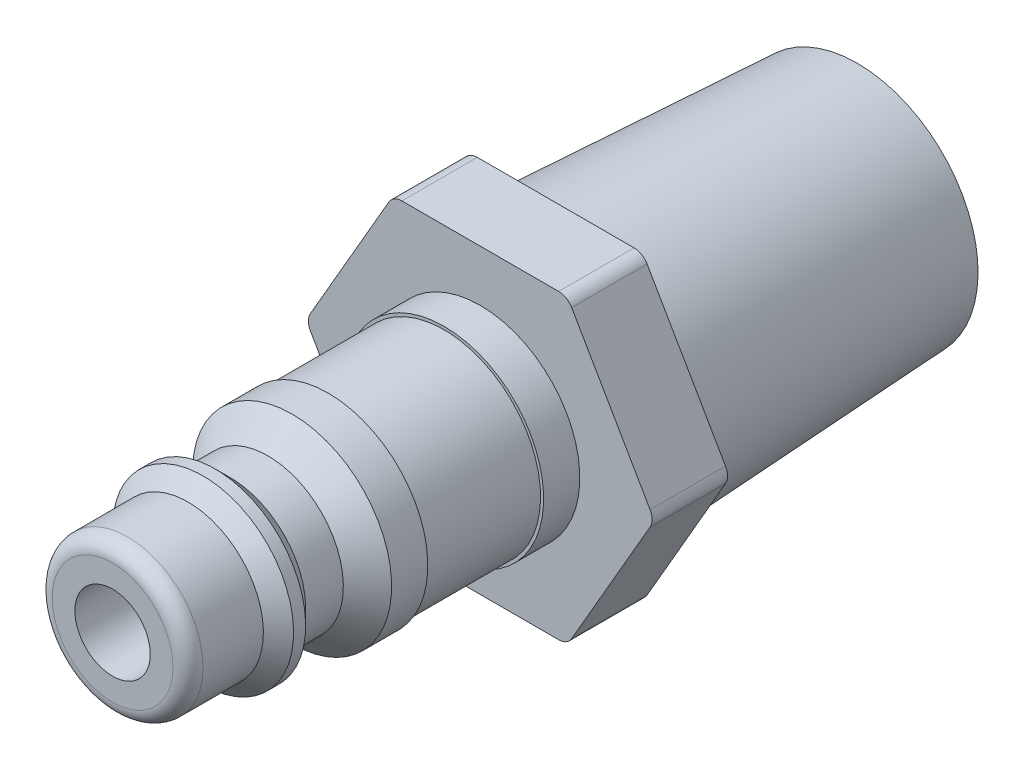
ISO-10303-21;
HEADER;
FILE_DESCRIPTION(('STEP AP214'),'2;1');
FILE_NAME('part.step','',(''),(''),'','','');
FILE_SCHEMA(('AUTOMOTIVE_DESIGN { 1 0 10303 214 1 1 1 1 }'));
ENDSEC;
DATA;
#1=APPLICATION_CONTEXT('core data for automotive mechanical design processes');
#2=APPLICATION_PROTOCOL_DEFINITION('international standard','automotive_design',2000,#1);
#3=PRODUCT_CONTEXT('',#1,'mechanical');
#4=PRODUCT('Part','Part','',(#3));
#5=PRODUCT_RELATED_PRODUCT_CATEGORY('part','',(#4));
#6=PRODUCT_DEFINITION_FORMATION('','',#4);
#7=PRODUCT_DEFINITION_CONTEXT('part definition',#1,'design');
#8=PRODUCT_DEFINITION('design','',#6,#7);
#9=PRODUCT_DEFINITION_SHAPE('','',#8);
#10=(LENGTH_UNIT() NAMED_UNIT(*) SI_UNIT(.MILLI.,.METRE.));
#11=(NAMED_UNIT(*) PLANE_ANGLE_UNIT() SI_UNIT($,.RADIAN.));
#12=(NAMED_UNIT(*) SI_UNIT($,.STERADIAN.) SOLID_ANGLE_UNIT());
#13=UNCERTAINTY_MEASURE_WITH_UNIT(LENGTH_MEASURE(1.E-05),#10,'distance_accuracy_value','');
#14=(GEOMETRIC_REPRESENTATION_CONTEXT(3) GLOBAL_UNCERTAINTY_ASSIGNED_CONTEXT((#13)) GLOBAL_UNIT_ASSIGNED_CONTEXT((#10,
#11,#12)) REPRESENTATION_CONTEXT('',''));
#15=CARTESIAN_POINT('',(0.,0.,0.));
#16=DIRECTION('',(0.,0.,1.));
#17=DIRECTION('',(1.,0.,0.));
#18=AXIS2_PLACEMENT_3D('',#15,#16,#17);
#19=CARTESIAN_POINT('',(-3.66617420935412,-6.35,-31.353125));
#20=DIRECTION('',(0.866025403784439,0.499999999999999,0.));
#21=DIRECTION('',(-0.5,0.866025403784439,0.));
#22=AXIS2_PLACEMENT_3D('',#19,#20,#21);
#23=PLANE('',#22);
#24=DIRECTION('',(-0.5,0.866025403784439,0.));
#25=VECTOR('',#24,1.);
#26=CARTESIAN_POINT('',(-3.66617420935412,-6.35,-15.478125));
#27=LINE('',#26,#25);
#28=CARTESIAN_POINT('',(-3.84948291982183,-6.0325,-15.478125));
#29=VERTEX_POINT('',#28);
#30=CARTESIAN_POINT('',(-7.14903970824054,-0.317499999999997,-15.478125));
#31=VERTEX_POINT('',#30);
#32=EDGE_CURVE('E327',#29,#31,#27,.T.);
#33=ORIENTED_EDGE('',*,*,#32,.T.);
#34=DIRECTION('',(0.,0.,1.));
#35=VECTOR('',#34,1.);
#36=CARTESIAN_POINT('',(-7.14903970824054,-0.317499999999998,-31.353125));
#37=LINE('',#36,#35);
#38=CARTESIAN_POINT('',(-7.14903970824054,-0.317499999999996,-18.653125));
#39=VERTEX_POINT('',#38);
#40=EDGE_CURVE('E179',#31,#39,#37,.F.);
#41=ORIENTED_EDGE('',*,*,#40,.T.);
#42=DIRECTION('',(-0.5,0.866025403784439,0.));
#43=VECTOR('',#42,1.);
#44=CARTESIAN_POINT('',(-3.66617420935412,-6.35,-18.653125));
#45=LINE('',#44,#43);
#46=CARTESIAN_POINT('',(-3.84948291982183,-6.0325,-18.653125));
#47=VERTEX_POINT('',#46);
#48=EDGE_CURVE('E324',#47,#39,#45,.T.);
#49=ORIENTED_EDGE('',*,*,#48,.F.);
#50=DIRECTION('',(0.,0.,1.));
#51=VECTOR('',#50,1.);
#52=CARTESIAN_POINT('',(-3.84948291982183,-6.0325,-31.353125));
#53=LINE('',#52,#51);
#54=EDGE_CURVE('E133',#47,#29,#53,.T.);
#55=ORIENTED_EDGE('',*,*,#54,.T.);
#56=EDGE_LOOP('',(#33,#41,#49,#55));
#57=FACE_BOUND('',#56,.T.);
#58=ADVANCED_FACE('F32',(#57),#23,.F.);
#59=CARTESIAN_POINT('',(-7.33234841870824,0.,-31.353125));
#60=DIRECTION('',(0.866025403784439,-0.5,0.));
#61=DIRECTION('',(0.5,0.866025403784439,0.));
#62=AXIS2_PLACEMENT_3D('',#59,#60,#61);
#63=PLANE('',#62);
#64=DIRECTION('',(0.5,0.866025403784439,0.));
#65=VECTOR('',#64,1.);
#66=CARTESIAN_POINT('',(-7.33234841870824,0.,-15.478125));
#67=LINE('',#66,#65);
#68=CARTESIAN_POINT('',(-7.14903970824054,0.317500000000002,-15.478125));
#69=VERTEX_POINT('',#68);
#70=CARTESIAN_POINT('',(-3.84948291982183,6.03250000000001,-15.478125));
#71=VERTEX_POINT('',#70);
#72=EDGE_CURVE('E329',#69,#71,#67,.T.);
#73=ORIENTED_EDGE('',*,*,#72,.T.);
#74=DIRECTION('',(0.,0.,1.));
#75=VECTOR('',#74,1.);
#76=CARTESIAN_POINT('',(-3.84948291982183,6.03250000000001,-31.353125));
#77=LINE('',#76,#75);
#78=CARTESIAN_POINT('',(-3.84948291982183,6.03250000000001,-18.653125));
#79=VERTEX_POINT('',#78);
#80=EDGE_CURVE('E167',#71,#79,#77,.F.);
#81=ORIENTED_EDGE('',*,*,#80,.T.);
#82=DIRECTION('',(0.5,0.866025403784439,0.));
#83=VECTOR('',#82,1.);
#84=CARTESIAN_POINT('',(-7.33234841870824,0.,-18.653125));
#85=LINE('',#84,#83);
#86=CARTESIAN_POINT('',(-7.14903970824054,0.317500000000002,-18.653125));
#87=VERTEX_POINT('',#86);
#88=EDGE_CURVE('E129',#87,#79,#85,.T.);
#89=ORIENTED_EDGE('',*,*,#88,.F.);
#90=DIRECTION('',(0.,0.,1.));
#91=VECTOR('',#90,1.);
#92=CARTESIAN_POINT('',(-7.14903970824054,0.317500000000002,-31.353125));
#93=LINE('',#92,#91);
#94=EDGE_CURVE('E164',#87,#69,#93,.T.);
#95=ORIENTED_EDGE('',*,*,#94,.T.);
#96=EDGE_LOOP('',(#73,#81,#89,#95));
#97=FACE_BOUND('',#96,.T.);
#98=ADVANCED_FACE('F210',(#97),#63,.F.);
#99=CARTESIAN_POINT('',(-3.66617420935412,6.35000000000001,-31.353125));
#100=DIRECTION('',(0.,-1.,0.));
#101=DIRECTION('',(0.,0.,-1.));
#102=AXIS2_PLACEMENT_3D('',#99,#100,#101);
#103=PLANE('',#102);
#104=DIRECTION('',(1.,0.,0.));
#105=VECTOR('',#104,1.);
#106=CARTESIAN_POINT('',(-3.66617420935412,6.35000000000001,-18.653125));
#107=LINE('',#106,#105);
#108=CARTESIAN_POINT('',(-3.29955678841871,6.35000000000001,-18.653125));
#109=VERTEX_POINT('',#108);
#110=CARTESIAN_POINT('',(3.29955678841871,6.35000000000001,-18.653125));
#111=VERTEX_POINT('',#110);
#112=EDGE_CURVE('E126',#109,#111,#107,.T.);
#113=ORIENTED_EDGE('',*,*,#112,.F.);
#114=DIRECTION('',(0.,0.,1.));
#115=VECTOR('',#114,1.);
#116=CARTESIAN_POINT('',(-3.29955678841871,6.35000000000001,-31.353125));
#117=LINE('',#116,#115);
#118=CARTESIAN_POINT('',(-3.29955678841871,6.35000000000001,-15.478125));
#119=VERTEX_POINT('',#118);
#120=EDGE_CURVE('E140',#109,#119,#117,.T.);
#121=ORIENTED_EDGE('',*,*,#120,.T.);
#122=DIRECTION('',(1.,0.,0.));
#123=VECTOR('',#122,1.);
#124=CARTESIAN_POINT('',(-3.66617420935412,6.35000000000001,-15.478125));
#125=LINE('',#124,#123);
#126=CARTESIAN_POINT('',(3.29955678841871,6.35000000000001,-15.478125));
#127=VERTEX_POINT('',#126);
#128=EDGE_CURVE('E332',#119,#127,#125,.T.);
#129=ORIENTED_EDGE('',*,*,#128,.T.);
#130=DIRECTION('',(0.,0.,1.));
#131=VECTOR('',#130,1.);
#132=CARTESIAN_POINT('',(3.29955678841871,6.35000000000001,-31.353125));
#133=LINE('',#132,#131);
#134=EDGE_CURVE('E143',#127,#111,#133,.F.);
#135=ORIENTED_EDGE('',*,*,#134,.T.);
#136=EDGE_LOOP('',(#113,#121,#129,#135));
#137=FACE_BOUND('',#136,.T.);
#138=ADVANCED_FACE('F138',(#137),#103,.F.);
#139=CARTESIAN_POINT('',(3.66617420935412,6.35000000000001,-31.353125));
#140=DIRECTION('',(-0.866025403784439,-0.5,0.));
#141=DIRECTION('',(0.5,-0.866025403784439,0.));
#142=AXIS2_PLACEMENT_3D('',#139,#140,#141);
#143=PLANE('',#142);
#144=DIRECTION('',(0.5,-0.866025403784439,0.));
#145=VECTOR('',#144,1.);
#146=CARTESIAN_POINT('',(3.66617420935412,6.35000000000001,-15.478125));
#147=LINE('',#146,#145);
#148=CARTESIAN_POINT('',(3.84948291982183,6.03250000000001,-15.478125));
#149=VERTEX_POINT('',#148);
#150=CARTESIAN_POINT('',(7.14903970824054,0.317499999999998,-15.478125));
#151=VERTEX_POINT('',#150);
#152=EDGE_CURVE('E334',#149,#151,#147,.T.);
#153=ORIENTED_EDGE('',*,*,#152,.T.);
#154=DIRECTION('',(0.,0.,1.));
#155=VECTOR('',#154,1.);
#156=CARTESIAN_POINT('',(7.14903970824054,0.317499999999997,-31.353125));
#157=LINE('',#156,#155);
#158=CARTESIAN_POINT('',(7.14903970824054,0.317499999999997,-18.653125));
#159=VERTEX_POINT('',#158);
#160=EDGE_CURVE('E193',#151,#159,#157,.F.);
#161=ORIENTED_EDGE('',*,*,#160,.T.);
#162=DIRECTION('',(0.5,-0.866025403784439,0.));
#163=VECTOR('',#162,1.);
#164=CARTESIAN_POINT('',(3.66617420935412,6.35000000000001,-18.653125));
#165=LINE('',#164,#163);
#166=CARTESIAN_POINT('',(3.84948291982183,6.03250000000001,-18.653125));
#167=VERTEX_POINT('',#166);
#168=EDGE_CURVE('E144',#167,#159,#165,.T.);
#169=ORIENTED_EDGE('',*,*,#168,.F.);
#170=DIRECTION('',(0.,0.,1.));
#171=VECTOR('',#170,1.);
#172=CARTESIAN_POINT('',(3.84948291982183,6.03250000000001,-31.353125));
#173=LINE('',#172,#171);
#174=EDGE_CURVE('E190',#167,#149,#173,.T.);
#175=ORIENTED_EDGE('',*,*,#174,.T.);
#176=EDGE_LOOP('',(#153,#161,#169,#175));
#177=FACE_BOUND('',#176,.T.);
#178=ADVANCED_FACE('F393',(#177),#143,.F.);
#179=CARTESIAN_POINT('',(7.33234841870825,0.,-31.353125));
#180=DIRECTION('',(-0.866025403784439,0.5,0.));
#181=DIRECTION('',(-0.5,-0.866025403784439,0.));
#182=AXIS2_PLACEMENT_3D('',#179,#180,#181);
#183=PLANE('',#182);
#184=DIRECTION('',(-0.5,-0.866025403784439,0.));
#185=VECTOR('',#184,1.);
#186=CARTESIAN_POINT('',(7.33234841870825,0.,-15.478125));
#187=LINE('',#186,#185);
#188=CARTESIAN_POINT('',(7.14903970824054,-0.317500000000002,-15.478125));
#189=VERTEX_POINT('',#188);
#190=CARTESIAN_POINT('',(3.84948291982183,-6.0325,-15.478125));
#191=VERTEX_POINT('',#190);
#192=EDGE_CURVE('E337',#189,#191,#187,.T.);
#193=ORIENTED_EDGE('',*,*,#192,.T.);
#194=DIRECTION('',(0.,0.,1.));
#195=VECTOR('',#194,1.);
#196=CARTESIAN_POINT('',(3.84948291982183,-6.0325,-31.353125));
#197=LINE('',#196,#195);
#198=CARTESIAN_POINT('',(3.84948291982183,-6.0325,-18.653125));
#199=VERTEX_POINT('',#198);
#200=EDGE_CURVE('E188',#191,#199,#197,.F.);
#201=ORIENTED_EDGE('',*,*,#200,.T.);
#202=DIRECTION('',(-0.5,-0.866025403784439,0.));
#203=VECTOR('',#202,1.);
#204=CARTESIAN_POINT('',(7.33234841870825,0.,-18.653125));
#205=LINE('',#204,#203);
#206=CARTESIAN_POINT('',(7.14903970824054,-0.317500000000002,-18.653125));
#207=VERTEX_POINT('',#206);
#208=EDGE_CURVE('E308',#207,#199,#205,.T.);
#209=ORIENTED_EDGE('',*,*,#208,.F.);
#210=DIRECTION('',(0.,0.,1.));
#211=VECTOR('',#210,1.);
#212=CARTESIAN_POINT('',(7.14903970824054,-0.317500000000002,-31.353125));
#213=LINE('',#212,#211);
#214=EDGE_CURVE('E185',#207,#189,#213,.T.);
#215=ORIENTED_EDGE('',*,*,#214,.T.);
#216=EDGE_LOOP('',(#193,#201,#209,#215));
#217=FACE_BOUND('',#216,.T.);
#218=ADVANCED_FACE('F312',(#217),#183,.F.);
#219=CARTESIAN_POINT('',(3.66617420935413,-6.35,-31.353125));
#220=DIRECTION('',(0.,1.,0.));
#221=DIRECTION('',(-1.,0.,0.));
#222=AXIS2_PLACEMENT_3D('',#219,#220,#221);
#223=PLANE('',#222);
#224=DIRECTION('',(-1.,0.,0.));
#225=VECTOR('',#224,1.);
#226=CARTESIAN_POINT('',(3.66617420935413,-6.35,-15.478125));
#227=LINE('',#226,#225);
#228=CARTESIAN_POINT('',(3.29955678841872,-6.35,-15.478125));
#229=VERTEX_POINT('',#228);
#230=CARTESIAN_POINT('',(-3.29955678841871,-6.35,-15.478125));
#231=VERTEX_POINT('',#230);
#232=EDGE_CURVE('E339',#229,#231,#227,.T.);
#233=ORIENTED_EDGE('',*,*,#232,.T.);
#234=DIRECTION('',(0.,0.,1.));
#235=VECTOR('',#234,1.);
#236=CARTESIAN_POINT('',(-3.29955678841871,-6.35,-31.353125));
#237=LINE('',#236,#235);
#238=CARTESIAN_POINT('',(-3.29955678841871,-6.35,-18.653125));
#239=VERTEX_POINT('',#238);
#240=EDGE_CURVE('E47',#231,#239,#237,.F.);
#241=ORIENTED_EDGE('',*,*,#240,.T.);
#242=DIRECTION('',(-1.,0.,0.));
#243=VECTOR('',#242,1.);
#244=CARTESIAN_POINT('',(3.66617420935413,-6.35,-18.653125));
#245=LINE('',#244,#243);
#246=CARTESIAN_POINT('',(3.29955678841872,-6.35,-18.653125));
#247=VERTEX_POINT('',#246);
#248=EDGE_CURVE('E152',#247,#239,#245,.T.);
#249=ORIENTED_EDGE('',*,*,#248,.F.);
#250=DIRECTION('',(0.,0.,1.));
#251=VECTOR('',#250,1.);
#252=CARTESIAN_POINT('',(3.29955678841872,-6.35,-31.353125));
#253=LINE('',#252,#251);
#254=EDGE_CURVE('E181',#247,#229,#253,.T.);
#255=ORIENTED_EDGE('',*,*,#254,.T.);
#256=EDGE_LOOP('',(#233,#241,#249,#255));
#257=FACE_BOUND('',#256,.T.);
#258=ADVANCED_FACE('F283',(#257),#223,.F.);
#259=CARTESIAN_POINT('',(0.,4.191,-9.08049999999999));
#260=DIRECTION('',(0.,0.,1.));
#261=DIRECTION('',(0.,-1.,0.));
#262=AXIS2_PLACEMENT_3D('',#259,#260,#261);
#263=PLANE('',#262);
#264=CARTESIAN_POINT('',(0.,0.,-9.08049999999999));
#265=DIRECTION('',(0.,0.,1.));
#266=DIRECTION('',(0.,-1.,0.));
#267=AXIS2_PLACEMENT_3D('',#264,#265,#266);
#268=CIRCLE('',#267,4.191);
#269=CARTESIAN_POINT('',(0.,-4.191,-9.08049999999999));
#270=VERTEX_POINT('',#269);
#271=EDGE_CURVE('E377',#270,#270,#268,.T.);
#272=ORIENTED_EDGE('',*,*,#271,.F.);
#273=EDGE_LOOP('',(#272));
#274=FACE_BOUND('',#273,.T.);
#275=CARTESIAN_POINT('',(0.,0.,-9.08049999999999));
#276=DIRECTION('',(0.,0.,1.));
#277=DIRECTION('',(0.,-1.,0.));
#278=AXIS2_PLACEMENT_3D('',#275,#276,#277);
#279=CIRCLE('',#278,4.064);
#280=CARTESIAN_POINT('',(0.,-4.064,-9.08049999999999));
#281=VERTEX_POINT('',#280);
#282=EDGE_CURVE('E341',#281,#281,#279,.T.);
#283=ORIENTED_EDGE('',*,*,#282,.T.);
#284=EDGE_LOOP('',(#283));
#285=FACE_BOUND('',#284,.T.);
#286=ADVANCED_FACE('F279',(#274,#285),#263,.F.);
#287=CARTESIAN_POINT('',(0.,0.,-12.7));
#288=DIRECTION('',(0.,0.,1.));
#289=DIRECTION('',(0.,-1.,0.));
#290=AXIS2_PLACEMENT_3D('',#287,#288,#289);
#291=CYLINDRICAL_SURFACE('',#290,4.191);
#292=CARTESIAN_POINT('',(0.,0.,-7.55649999999999));
#293=DIRECTION('',(0.,0.,1.));
#294=DIRECTION('',(0.,-1.,0.));
#295=AXIS2_PLACEMENT_3D('',#292,#293,#294);
#296=CIRCLE('',#295,4.191);
#297=CARTESIAN_POINT('',(0.,-4.191,-7.55649999999999));
#298=VERTEX_POINT('',#297);
#299=EDGE_CURVE('E374',#298,#298,#296,.T.);
#300=ORIENTED_EDGE('',*,*,#299,.F.);
#301=EDGE_LOOP('',(#300));
#302=FACE_BOUND('',#301,.T.);
#303=ORIENTED_EDGE('',*,*,#271,.T.);
#304=EDGE_LOOP('',(#303));
#305=FACE_BOUND('',#304,.T.);
#306=ADVANCED_FACE('F275',(#302,#305),#291,.T.);
#307=CARTESIAN_POINT('',(0.,0.,-7.55649999999999));
#308=DIRECTION('',(0.,0.,-1.));
#309=DIRECTION('',(0.,1.,0.));
#310=AXIS2_PLACEMENT_3D('',#307,#308,#309);
#311=CONICAL_SURFACE('',#310,4.191,0.78539816339745);
#312=CARTESIAN_POINT('',(0.,0.,-6.54049999999999));
#313=DIRECTION('',(0.,0.,1.));
#314=DIRECTION('',(0.,-1.,0.));
#315=AXIS2_PLACEMENT_3D('',#312,#313,#314);
#316=CIRCLE('',#315,3.175);
#317=CARTESIAN_POINT('',(0.,-3.175,-6.54049999999999));
#318=VERTEX_POINT('',#317);
#319=EDGE_CURVE('E371',#318,#318,#316,.T.);
#320=ORIENTED_EDGE('',*,*,#319,.F.);
#321=EDGE_LOOP('',(#320));
#322=FACE_BOUND('',#321,.T.);
#323=ORIENTED_EDGE('',*,*,#299,.T.);
#324=EDGE_LOOP('',(#323));
#325=FACE_BOUND('',#324,.T.);
#326=ADVANCED_FACE('F271',(#322,#325),#311,.T.);
#327=CARTESIAN_POINT('',(0.,0.,-12.7));
#328=DIRECTION('',(0.,0.,1.));
#329=DIRECTION('',(0.,-1.,0.));
#330=AXIS2_PLACEMENT_3D('',#327,#328,#329);
#331=CYLINDRICAL_SURFACE('',#330,3.175);
#332=CARTESIAN_POINT('',(0.,0.,-4.95299999999999));
#333=DIRECTION('',(0.,0.,1.));
#334=DIRECTION('',(0.,-1.,0.));
#335=AXIS2_PLACEMENT_3D('',#332,#333,#334);
#336=CIRCLE('',#335,3.175);
#337=CARTESIAN_POINT('',(0.,-3.175,-4.95299999999999));
#338=VERTEX_POINT('',#337);
#339=EDGE_CURVE('E368',#338,#338,#336,.T.);
#340=ORIENTED_EDGE('',*,*,#339,.F.);
#341=EDGE_LOOP('',(#340));
#342=FACE_BOUND('',#341,.T.);
#343=ORIENTED_EDGE('',*,*,#319,.T.);
#344=EDGE_LOOP('',(#343));
#345=FACE_BOUND('',#344,.T.);
#346=ADVANCED_FACE('F267',(#342,#345),#331,.T.);
#347=CARTESIAN_POINT('',(0.,0.,-4.95299999999999));
#348=DIRECTION('',(0.,0.,1.));
#349=DIRECTION('',(0.,-1.,0.));
#350=AXIS2_PLACEMENT_3D('',#347,#348,#349);
#351=CONICAL_SURFACE('',#350,3.175,0.78539816339745);
#352=CARTESIAN_POINT('',(0.,0.,-4.318));
#353=DIRECTION('',(0.,0.,1.));
#354=DIRECTION('',(0.,-1.,0.));
#355=AXIS2_PLACEMENT_3D('',#352,#353,#354);
#356=CIRCLE('',#355,3.81);
#357=CARTESIAN_POINT('',(0.,-3.81,-4.318));
#358=VERTEX_POINT('',#357);
#359=EDGE_CURVE('E365',#358,#358,#356,.T.);
#360=ORIENTED_EDGE('',*,*,#359,.F.);
#361=EDGE_LOOP('',(#360));
#362=FACE_BOUND('',#361,.T.);
#363=ORIENTED_EDGE('',*,*,#339,.T.);
#364=EDGE_LOOP('',(#363));
#365=FACE_BOUND('',#364,.T.);
#366=ADVANCED_FACE('F263',(#362,#365),#351,.T.);
#367=CARTESIAN_POINT('',(0.,0.,-12.7));
#368=DIRECTION('',(0.,0.,1.));
#369=DIRECTION('',(0.,-1.,0.));
#370=AXIS2_PLACEMENT_3D('',#367,#368,#369);
#371=CYLINDRICAL_SURFACE('',#370,3.81);
#372=CARTESIAN_POINT('',(0.,0.,-3.81));
#373=DIRECTION('',(0.,0.,1.));
#374=DIRECTION('',(0.,-1.,0.));
#375=AXIS2_PLACEMENT_3D('',#372,#373,#374);
#376=CIRCLE('',#375,3.81);
#377=CARTESIAN_POINT('',(0.,-3.81,-3.81));
#378=VERTEX_POINT('',#377);
#379=EDGE_CURVE('E362',#378,#378,#376,.T.);
#380=ORIENTED_EDGE('',*,*,#379,.F.);
#381=EDGE_LOOP('',(#380));
#382=FACE_BOUND('',#381,.T.);
#383=ORIENTED_EDGE('',*,*,#359,.T.);
#384=EDGE_LOOP('',(#383));
#385=FACE_BOUND('',#384,.T.);
#386=ADVANCED_FACE('F259',(#382,#385),#371,.T.);
#387=CARTESIAN_POINT('',(0.,0.,-3.81));
#388=DIRECTION('',(0.,0.,-1.));
#389=DIRECTION('',(0.,1.,0.));
#390=AXIS2_PLACEMENT_3D('',#387,#388,#389);
#391=CONICAL_SURFACE('',#390,3.81,0.785398163397451);
#392=CARTESIAN_POINT('',(0.,0.,-3.175));
#393=DIRECTION('',(0.,0.,1.));
#394=DIRECTION('',(0.,-1.,0.));
#395=AXIS2_PLACEMENT_3D('',#392,#393,#394);
#396=CIRCLE('',#395,3.175);
#397=CARTESIAN_POINT('',(0.,-3.175,-3.175));
#398=VERTEX_POINT('',#397);
#399=EDGE_CURVE('E359',#398,#398,#396,.T.);
#400=ORIENTED_EDGE('',*,*,#399,.F.);
#401=EDGE_LOOP('',(#400));
#402=FACE_BOUND('',#401,.T.);
#403=ORIENTED_EDGE('',*,*,#379,.T.);
#404=EDGE_LOOP('',(#403));
#405=FACE_BOUND('',#404,.T.);
#406=ADVANCED_FACE('F255',(#402,#405),#391,.T.);
#407=CARTESIAN_POINT('',(0.,0.,-12.7));
#408=DIRECTION('',(0.,0.,1.));
#409=DIRECTION('',(0.,-1.,0.));
#410=AXIS2_PLACEMENT_3D('',#407,#408,#409);
#411=CYLINDRICAL_SURFACE('',#410,3.175);
#412=CARTESIAN_POINT('',(0.,0.,-0.635));
#413=DIRECTION('',(0.,0.,-1.));
#414=DIRECTION('',(0.,1.,0.));
#415=AXIS2_PLACEMENT_3D('',#412,#413,#414);
#416=CIRCLE('',#415,3.175);
#417=CARTESIAN_POINT('',(0.,3.175,-0.635));
#418=VERTEX_POINT('',#417);
#419=EDGE_CURVE('E11',#418,#418,#416,.T.);
#420=ORIENTED_EDGE('',*,*,#419,.T.);
#421=EDGE_LOOP('',(#420));
#422=FACE_BOUND('',#421,.T.);
#423=ORIENTED_EDGE('',*,*,#399,.T.);
#424=EDGE_LOOP('',(#423));
#425=FACE_BOUND('',#424,.T.);
#426=ADVANCED_FACE('F252',(#422,#425),#411,.T.);
#427=CARTESIAN_POINT('',(0.,1.5875,0.));
#428=DIRECTION('',(0.,0.,-1.));
#429=DIRECTION('',(0.,1.,0.));
#430=AXIS2_PLACEMENT_3D('',#427,#428,#429);
#431=PLANE('',#430);
#432=CARTESIAN_POINT('',(0.,0.,0.));
#433=DIRECTION('',(0.,0.,-1.));
#434=DIRECTION('',(0.,1.,0.));
#435=AXIS2_PLACEMENT_3D('',#432,#433,#434);
#436=CIRCLE('',#435,2.54);
#437=CARTESIAN_POINT('',(0.,2.54,0.));
#438=VERTEX_POINT('',#437);
#439=EDGE_CURVE('E40',#438,#438,#436,.F.);
#440=ORIENTED_EDGE('',*,*,#439,.T.);
#441=EDGE_LOOP('',(#440));
#442=FACE_BOUND('',#441,.T.);
#443=CARTESIAN_POINT('',(0.,0.,0.));
#444=DIRECTION('',(0.,0.,1.));
#445=DIRECTION('',(0.,-1.,0.));
#446=AXIS2_PLACEMENT_3D('',#443,#444,#445);
#447=CIRCLE('',#446,1.5875);
#448=CARTESIAN_POINT('',(0.,-1.5875,0.));
#449=VERTEX_POINT('',#448);
#450=EDGE_CURVE('E356',#449,#449,#447,.T.);
#451=ORIENTED_EDGE('',*,*,#450,.F.);
#452=EDGE_LOOP('',(#451));
#453=FACE_BOUND('',#452,.T.);
#454=ADVANCED_FACE('F197',(#442,#453),#431,.F.);
#455=CARTESIAN_POINT('',(0.,0.,-12.7));
#456=DIRECTION('',(0.,0.,1.));
#457=DIRECTION('',(0.,-1.,0.));
#458=AXIS2_PLACEMENT_3D('',#455,#456,#457);
#459=CYLINDRICAL_SURFACE('',#458,1.5875);
#460=CARTESIAN_POINT('',(0.,0.,-12.7));
#461=DIRECTION('',(0.,0.,1.));
#462=DIRECTION('',(0.,-1.,0.));
#463=AXIS2_PLACEMENT_3D('',#460,#461,#462);
#464=CIRCLE('',#463,1.5875);
#465=CARTESIAN_POINT('',(0.,-1.5875,-12.7));
#466=VERTEX_POINT('',#465);
#467=EDGE_CURVE('E353',#466,#466,#464,.T.);
#468=ORIENTED_EDGE('',*,*,#467,.F.);
#469=EDGE_LOOP('',(#468));
#470=FACE_BOUND('',#469,.T.);
#471=ORIENTED_EDGE('',*,*,#450,.T.);
#472=EDGE_LOOP('',(#471));
#473=FACE_BOUND('',#472,.T.);
#474=ADVANCED_FACE('F245',(#470,#473),#459,.F.);
#475=CARTESIAN_POINT('',(0.,1.5875,-12.7));
#476=DIRECTION('',(0.,0.,-1.));
#477=DIRECTION('',(0.,1.,0.));
#478=AXIS2_PLACEMENT_3D('',#475,#476,#477);
#479=PLANE('',#478);
#480=ORIENTED_EDGE('',*,*,#467,.T.);
#481=EDGE_LOOP('',(#480));
#482=FACE_BOUND('',#481,.T.);
#483=ADVANCED_FACE('F236',(#482),#479,.F.);
#484=CARTESIAN_POINT('',(0.,4.191,-15.478125));
#485=DIRECTION('',(0.,0.,-1.));
#486=DIRECTION('',(0.,1.,0.));
#487=AXIS2_PLACEMENT_3D('',#484,#485,#486);
#488=PLANE('',#487);
#489=ORIENTED_EDGE('',*,*,#128,.F.);
#490=CARTESIAN_POINT('',(-3.29955678841871,5.71500000000001,-15.478125));
#491=DIRECTION('',(0.,0.,-1.));
#492=DIRECTION('',(0.,1.,0.));
#493=AXIS2_PLACEMENT_3D('',#490,#491,#492);
#494=CIRCLE('',#493,0.635);
#495=EDGE_CURVE('E147',#119,#71,#494,.F.);
#496=ORIENTED_EDGE('',*,*,#495,.T.);
#497=ORIENTED_EDGE('',*,*,#72,.F.);
#498=CARTESIAN_POINT('',(-6.59911357683742,0.,-15.478125));
#499=DIRECTION('',(0.,0.,-1.));
#500=DIRECTION('',(0.,1.,0.));
#501=AXIS2_PLACEMENT_3D('',#498,#499,#500);
#502=CIRCLE('',#501,0.635);
#503=EDGE_CURVE('E161',#69,#31,#502,.F.);
#504=ORIENTED_EDGE('',*,*,#503,.T.);
#505=ORIENTED_EDGE('',*,*,#32,.F.);
#506=CARTESIAN_POINT('',(-3.29955678841871,-5.715,-15.478125));
#507=DIRECTION('',(0.,0.,-1.));
#508=DIRECTION('',(0.,1.,0.));
#509=AXIS2_PLACEMENT_3D('',#506,#507,#508);
#510=CIRCLE('',#509,0.635);
#511=EDGE_CURVE('E159',#29,#231,#510,.F.);
#512=ORIENTED_EDGE('',*,*,#511,.T.);
#513=ORIENTED_EDGE('',*,*,#232,.F.);
#514=CARTESIAN_POINT('',(3.29955678841872,-5.715,-15.478125));
#515=DIRECTION('',(0.,0.,-1.));
#516=DIRECTION('',(0.,1.,0.));
#517=AXIS2_PLACEMENT_3D('',#514,#515,#516);
#518=CIRCLE('',#517,0.635);
#519=EDGE_CURVE('E157',#229,#191,#518,.F.);
#520=ORIENTED_EDGE('',*,*,#519,.T.);
#521=ORIENTED_EDGE('',*,*,#192,.F.);
#522=CARTESIAN_POINT('',(6.59911357683742,0.,-15.478125));
#523=DIRECTION('',(0.,0.,-1.));
#524=DIRECTION('',(0.,1.,0.));
#525=AXIS2_PLACEMENT_3D('',#522,#523,#524);
#526=CIRCLE('',#525,0.635);
#527=EDGE_CURVE('E150',#189,#151,#526,.F.);
#528=ORIENTED_EDGE('',*,*,#527,.T.);
#529=ORIENTED_EDGE('',*,*,#152,.F.);
#530=CARTESIAN_POINT('',(3.29955678841871,5.71500000000001,-15.478125));
#531=DIRECTION('',(0.,0.,-1.));
#532=DIRECTION('',(0.,1.,0.));
#533=AXIS2_PLACEMENT_3D('',#530,#531,#532);
#534=CIRCLE('',#533,0.635);
#535=EDGE_CURVE('E148',#149,#127,#534,.F.);
#536=ORIENTED_EDGE('',*,*,#535,.T.);
#537=EDGE_LOOP('',(#489,#496,#497,#504,#505,#512,#513,#520,#521,#528,#529,#536));
#538=FACE_BOUND('',#537,.T.);
#539=CARTESIAN_POINT('',(0.,0.,-15.478125));
#540=DIRECTION('',(0.,0.,1.));
#541=DIRECTION('',(0.,-1.,0.));
#542=AXIS2_PLACEMENT_3D('',#539,#540,#541);
#543=CIRCLE('',#542,4.191);
#544=CARTESIAN_POINT('',(0.,-4.191,-15.478125));
#545=VERTEX_POINT('',#544);
#546=EDGE_CURVE('E350',#545,#545,#543,.T.);
#547=ORIENTED_EDGE('',*,*,#546,.F.);
#548=EDGE_LOOP('',(#547));
#549=FACE_BOUND('',#548,.T.);
#550=ADVANCED_FACE('F232',(#538,#549),#488,.F.);
#551=CARTESIAN_POINT('',(0.,0.,-12.7));
#552=DIRECTION('',(0.,0.,1.));
#553=DIRECTION('',(0.,-1.,0.));
#554=AXIS2_PLACEMENT_3D('',#551,#552,#553);
#555=CYLINDRICAL_SURFACE('',#554,4.191);
#556=CARTESIAN_POINT('',(0.,0.,-13.954125));
#557=DIRECTION('',(0.,0.,1.));
#558=DIRECTION('',(0.,-1.,0.));
#559=AXIS2_PLACEMENT_3D('',#556,#557,#558);
#560=CIRCLE('',#559,4.191);
#561=CARTESIAN_POINT('',(0.,-4.191,-13.954125));
#562=VERTEX_POINT('',#561);
#563=EDGE_CURVE('E347',#562,#562,#560,.T.);
#564=ORIENTED_EDGE('',*,*,#563,.F.);
#565=EDGE_LOOP('',(#564));
#566=FACE_BOUND('',#565,.T.);
#567=ORIENTED_EDGE('',*,*,#546,.T.);
#568=EDGE_LOOP('',(#567));
#569=FACE_BOUND('',#568,.T.);
#570=ADVANCED_FACE('F228',(#566,#569),#555,.T.);
#571=CARTESIAN_POINT('',(0.,4.191,-13.954125));
#572=DIRECTION('',(0.,0.,-1.));
#573=DIRECTION('',(0.,1.,0.));
#574=AXIS2_PLACEMENT_3D('',#571,#572,#573);
#575=PLANE('',#574);
#576=CARTESIAN_POINT('',(0.,0.,-13.954125));
#577=DIRECTION('',(0.,0.,1.));
#578=DIRECTION('',(0.,-1.,0.));
#579=AXIS2_PLACEMENT_3D('',#576,#577,#578);
#580=CIRCLE('',#579,4.064);
#581=CARTESIAN_POINT('',(0.,-4.064,-13.954125));
#582=VERTEX_POINT('',#581);
#583=EDGE_CURVE('E344',#582,#582,#580,.T.);
#584=ORIENTED_EDGE('',*,*,#583,.F.);
#585=EDGE_LOOP('',(#584));
#586=FACE_BOUND('',#585,.T.);
#587=ORIENTED_EDGE('',*,*,#563,.T.);
#588=EDGE_LOOP('',(#587));
#589=FACE_BOUND('',#588,.T.);
#590=ADVANCED_FACE('F224',(#586,#589),#575,.F.);
#591=CARTESIAN_POINT('',(0.,0.,-12.7));
#592=DIRECTION('',(0.,0.,1.));
#593=DIRECTION('',(0.,-1.,0.));
#594=AXIS2_PLACEMENT_3D('',#591,#592,#593);
#595=CYLINDRICAL_SURFACE('',#594,4.064);
#596=ORIENTED_EDGE('',*,*,#282,.F.);
#597=EDGE_LOOP('',(#596));
#598=FACE_BOUND('',#597,.T.);
#599=ORIENTED_EDGE('',*,*,#583,.T.);
#600=EDGE_LOOP('',(#599));
#601=FACE_BOUND('',#600,.T.);
#602=ADVANCED_FACE('F221',(#598,#601),#595,.T.);
#603=CARTESIAN_POINT('',(0.,0.,-18.653125));
#604=DIRECTION('',(0.,0.,-1.));
#605=DIRECTION('',(0.,1.,0.));
#606=AXIS2_PLACEMENT_3D('',#603,#604,#605);
#607=PLANE('',#606);
#608=CARTESIAN_POINT('',(0.,0.,-18.653125));
#609=DIRECTION('',(0.,0.,-1.));
#610=DIRECTION('',(0.,1.,0.));
#611=AXIS2_PLACEMENT_3D('',#608,#609,#610);
#612=CIRCLE('',#611,5.74557879689462);
#613=CARTESIAN_POINT('',(0.,5.74557879689462,-18.653125));
#614=VERTEX_POINT('',#613);
#615=EDGE_CURVE('E315',#614,#614,#612,.T.);
#616=ORIENTED_EDGE('',*,*,#615,.F.);
#617=EDGE_LOOP('',(#616));
#618=FACE_BOUND('',#617,.T.);
#619=ORIENTED_EDGE('',*,*,#88,.T.);
#620=CARTESIAN_POINT('',(-3.29955678841871,5.71500000000001,-18.653125));
#621=DIRECTION('',(0.,0.,-1.));
#622=DIRECTION('',(0.,1.,0.));
#623=AXIS2_PLACEMENT_3D('',#620,#621,#622);
#624=CIRCLE('',#623,0.635);
#625=EDGE_CURVE('E123',#79,#109,#624,.T.);
#626=ORIENTED_EDGE('',*,*,#625,.T.);
#627=ORIENTED_EDGE('',*,*,#112,.T.);
#628=CARTESIAN_POINT('',(3.29955678841871,5.71500000000001,-18.653125));
#629=DIRECTION('',(0.,0.,-1.));
#630=DIRECTION('',(0.,1.,0.));
#631=AXIS2_PLACEMENT_3D('',#628,#629,#630);
#632=CIRCLE('',#631,0.635);
#633=EDGE_CURVE('E169',#111,#167,#632,.T.);
#634=ORIENTED_EDGE('',*,*,#633,.T.);
#635=ORIENTED_EDGE('',*,*,#168,.T.);
#636=CARTESIAN_POINT('',(6.59911357683742,0.,-18.653125));
#637=DIRECTION('',(0.,0.,-1.));
#638=DIRECTION('',(0.,1.,0.));
#639=AXIS2_PLACEMENT_3D('',#636,#637,#638);
#640=CIRCLE('',#639,0.635);
#641=EDGE_CURVE('E171',#159,#207,#640,.T.);
#642=ORIENTED_EDGE('',*,*,#641,.T.);
#643=ORIENTED_EDGE('',*,*,#208,.T.);
#644=CARTESIAN_POINT('',(3.29955678841872,-5.715,-18.653125));
#645=DIRECTION('',(0.,0.,-1.));
#646=DIRECTION('',(0.,1.,0.));
#647=AXIS2_PLACEMENT_3D('',#644,#645,#646);
#648=CIRCLE('',#647,0.635);
#649=EDGE_CURVE('E54',#199,#247,#648,.T.);
#650=ORIENTED_EDGE('',*,*,#649,.T.);
#651=ORIENTED_EDGE('',*,*,#248,.T.);
#652=CARTESIAN_POINT('',(-3.29955678841871,-5.715,-18.653125));
#653=DIRECTION('',(0.,0.,-1.));
#654=DIRECTION('',(0.,1.,0.));
#655=AXIS2_PLACEMENT_3D('',#652,#653,#654);
#656=CIRCLE('',#655,0.635);
#657=EDGE_CURVE('E174',#239,#47,#656,.T.);
#658=ORIENTED_EDGE('',*,*,#657,.T.);
#659=ORIENTED_EDGE('',*,*,#48,.T.);
#660=CARTESIAN_POINT('',(-6.59911357683742,0.,-18.653125));
#661=DIRECTION('',(0.,0.,-1.));
#662=DIRECTION('',(0.,1.,0.));
#663=AXIS2_PLACEMENT_3D('',#660,#661,#662);
#664=CIRCLE('',#663,0.635);
#665=EDGE_CURVE('E134',#39,#87,#664,.T.);
#666=ORIENTED_EDGE('',*,*,#665,.T.);
#667=EDGE_LOOP('',(#619,#626,#627,#634,#635,#642,#643,#650,#651,#658,#659,#666));
#668=FACE_BOUND('',#667,.T.);
#669=ADVANCED_FACE('F125',(#618,#668),#607,.T.);
#670=CARTESIAN_POINT('',(0.,0.,-31.353125));
#671=DIRECTION('',(0.,0.,1.));
#672=DIRECTION('',(0.,1.,0.));
#673=AXIS2_PLACEMENT_3D('',#670,#671,#672);
#674=CONICAL_SURFACE('',#673,5.08,0.0523598775598299);
#675=ORIENTED_EDGE('',*,*,#615,.T.);
#676=EDGE_LOOP('',(#675));
#677=FACE_BOUND('',#676,.T.);
#678=CARTESIAN_POINT('',(0.,0.,-31.353125));
#679=DIRECTION('',(0.,0.,-1.));
#680=DIRECTION('',(0.,1.,0.));
#681=AXIS2_PLACEMENT_3D('',#678,#679,#680);
#682=CIRCLE('',#681,5.08);
#683=CARTESIAN_POINT('',(0.,5.08,-31.353125));
#684=VERTEX_POINT('',#683);
#685=EDGE_CURVE('E319',#684,#684,#682,.T.);
#686=ORIENTED_EDGE('',*,*,#685,.F.);
#687=EDGE_LOOP('',(#686));
#688=FACE_BOUND('',#687,.T.);
#689=ADVANCED_FACE('F241',(#677,#688),#674,.T.);
#690=CARTESIAN_POINT('',(0.,0.,-31.353125));
#691=DIRECTION('',(0.,0.,1.));
#692=DIRECTION('',(0.,-1.,0.));
#693=AXIS2_PLACEMENT_3D('',#690,#691,#692);
#694=PLANE('',#693);
#695=ORIENTED_EDGE('',*,*,#685,.T.);
#696=EDGE_LOOP('',(#695));
#697=FACE_BOUND('',#696,.T.);
#698=ADVANCED_FACE('F238',(#697),#694,.F.);
#699=CARTESIAN_POINT('',(-3.29955678841871,5.71500000000001,-31.353125));
#700=DIRECTION('',(0.,0.,1.));
#701=DIRECTION('',(1.,0.,0.));
#702=AXIS2_PLACEMENT_3D('',#699,#700,#701);
#703=CYLINDRICAL_SURFACE('',#702,0.635);
#704=ORIENTED_EDGE('',*,*,#625,.F.);
#705=ORIENTED_EDGE('',*,*,#80,.F.);
#706=ORIENTED_EDGE('',*,*,#495,.F.);
#707=ORIENTED_EDGE('',*,*,#120,.F.);
#708=EDGE_LOOP('',(#704,#705,#706,#707));
#709=FACE_BOUND('',#708,.T.);
#710=ADVANCED_FACE('F146',(#709),#703,.T.);
#711=CARTESIAN_POINT('',(-6.59911357683742,0.,-31.353125));
#712=DIRECTION('',(0.,0.,1.));
#713=DIRECTION('',(1.,0.,0.));
#714=AXIS2_PLACEMENT_3D('',#711,#712,#713);
#715=CYLINDRICAL_SURFACE('',#714,0.635);
#716=ORIENTED_EDGE('',*,*,#665,.F.);
#717=ORIENTED_EDGE('',*,*,#40,.F.);
#718=ORIENTED_EDGE('',*,*,#503,.F.);
#719=ORIENTED_EDGE('',*,*,#94,.F.);
#720=EDGE_LOOP('',(#716,#717,#718,#719));
#721=FACE_BOUND('',#720,.T.);
#722=ADVANCED_FACE('F287',(#721),#715,.T.);
#723=CARTESIAN_POINT('',(-3.29955678841871,-5.715,-31.353125));
#724=DIRECTION('',(0.,0.,1.));
#725=DIRECTION('',(1.,0.,0.));
#726=AXIS2_PLACEMENT_3D('',#723,#724,#725);
#727=CYLINDRICAL_SURFACE('',#726,0.635);
#728=ORIENTED_EDGE('',*,*,#657,.F.);
#729=ORIENTED_EDGE('',*,*,#240,.F.);
#730=ORIENTED_EDGE('',*,*,#511,.F.);
#731=ORIENTED_EDGE('',*,*,#54,.F.);
#732=EDGE_LOOP('',(#728,#729,#730,#731));
#733=FACE_BOUND('',#732,.T.);
#734=ADVANCED_FACE('F290',(#733),#727,.T.);
#735=CARTESIAN_POINT('',(3.29955678841872,-5.715,-31.353125));
#736=DIRECTION('',(0.,0.,1.));
#737=DIRECTION('',(1.,0.,0.));
#738=AXIS2_PLACEMENT_3D('',#735,#736,#737);
#739=CYLINDRICAL_SURFACE('',#738,0.635);
#740=ORIENTED_EDGE('',*,*,#649,.F.);
#741=ORIENTED_EDGE('',*,*,#200,.F.);
#742=ORIENTED_EDGE('',*,*,#519,.F.);
#743=ORIENTED_EDGE('',*,*,#254,.F.);
#744=EDGE_LOOP('',(#740,#741,#742,#743));
#745=FACE_BOUND('',#744,.T.);
#746=ADVANCED_FACE('F294',(#745),#739,.T.);
#747=CARTESIAN_POINT('',(6.59911357683742,0.,-31.353125));
#748=DIRECTION('',(0.,0.,1.));
#749=DIRECTION('',(1.,0.,0.));
#750=AXIS2_PLACEMENT_3D('',#747,#748,#749);
#751=CYLINDRICAL_SURFACE('',#750,0.635);
#752=ORIENTED_EDGE('',*,*,#641,.F.);
#753=ORIENTED_EDGE('',*,*,#160,.F.);
#754=ORIENTED_EDGE('',*,*,#527,.F.);
#755=ORIENTED_EDGE('',*,*,#214,.F.);
#756=EDGE_LOOP('',(#752,#753,#754,#755));
#757=FACE_BOUND('',#756,.T.);
#758=ADVANCED_FACE('F206',(#757),#751,.T.);
#759=CARTESIAN_POINT('',(3.29955678841871,5.71500000000001,-31.353125));
#760=DIRECTION('',(0.,0.,1.));
#761=DIRECTION('',(1.,0.,0.));
#762=AXIS2_PLACEMENT_3D('',#759,#760,#761);
#763=CYLINDRICAL_SURFACE('',#762,0.635);
#764=ORIENTED_EDGE('',*,*,#633,.F.);
#765=ORIENTED_EDGE('',*,*,#134,.F.);
#766=ORIENTED_EDGE('',*,*,#535,.F.);
#767=ORIENTED_EDGE('',*,*,#174,.F.);
#768=EDGE_LOOP('',(#764,#765,#766,#767));
#769=FACE_BOUND('',#768,.T.);
#770=ADVANCED_FACE('F201',(#769),#763,.T.);
#771=CARTESIAN_POINT('',(0.,0.,-0.635));
#772=DIRECTION('',(0.,0.,-1.));
#773=DIRECTION('',(0.,1.,0.));
#774=AXIS2_PLACEMENT_3D('',#771,#772,#773);
#775=TOROIDAL_SURFACE('',#774,2.54,0.635);
#776=ORIENTED_EDGE('',*,*,#419,.F.);
#777=EDGE_LOOP('',(#776));
#778=FACE_BOUND('',#777,.T.);
#779=ORIENTED_EDGE('',*,*,#439,.F.);
#780=EDGE_LOOP('',(#779));
#781=FACE_BOUND('',#780,.T.);
#782=ADVANCED_FACE('F34',(#778,#781),#775,.T.);
#783=CLOSED_SHELL('',(#58,#98,#138,#178,#218,#258,#286,#306,#326,#346,#366,#386,#406,#426,#454,
#474,#483,#550,#570,#590,#602,#669,#689,#698,#710,#722,#734,#746,#758,#770,#782));
#784=MANIFOLD_SOLID_BREP('B2',#783);
#785=ADVANCED_BREP_SHAPE_REPRESENTATION('',(#18,#784),#14);
#786=SHAPE_DEFINITION_REPRESENTATION(#9,#785);
ENDSEC;
END-ISO-10303-21;
